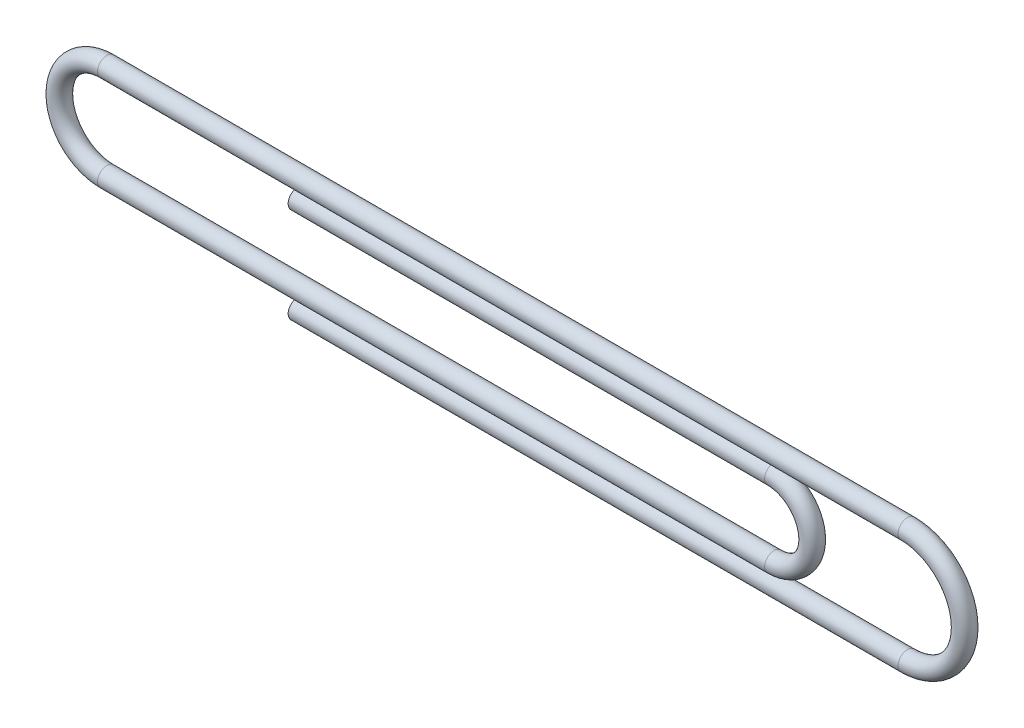
ISO-10303-21;
HEADER;
FILE_DESCRIPTION(('STEP AP214'),'2;1');
FILE_NAME('part.step','',(''),(''),'','','');
FILE_SCHEMA(('AUTOMOTIVE_DESIGN { 1 0 10303 214 1 1 1 1 }'));
ENDSEC;
DATA;
#1=APPLICATION_CONTEXT('core data for automotive mechanical design processes');
#2=APPLICATION_PROTOCOL_DEFINITION('international standard','automotive_design',2000,#1);
#3=PRODUCT_CONTEXT('',#1,'mechanical');
#4=PRODUCT('Part','Part','',(#3));
#5=PRODUCT_RELATED_PRODUCT_CATEGORY('part','',(#4));
#6=PRODUCT_DEFINITION_FORMATION('','',#4);
#7=PRODUCT_DEFINITION_CONTEXT('part definition',#1,'design');
#8=PRODUCT_DEFINITION('design','',#6,#7);
#9=PRODUCT_DEFINITION_SHAPE('','',#8);
#10=(LENGTH_UNIT() NAMED_UNIT(*) SI_UNIT(.MILLI.,.METRE.));
#11=(NAMED_UNIT(*) PLANE_ANGLE_UNIT() SI_UNIT($,.RADIAN.));
#12=(NAMED_UNIT(*) SI_UNIT($,.STERADIAN.) SOLID_ANGLE_UNIT());
#13=UNCERTAINTY_MEASURE_WITH_UNIT(LENGTH_MEASURE(1.E-05),#10,'distance_accuracy_value','');
#14=(GEOMETRIC_REPRESENTATION_CONTEXT(3) GLOBAL_UNCERTAINTY_ASSIGNED_CONTEXT((#13)) GLOBAL_UNIT_ASSIGNED_CONTEXT((#10,
#11,#12)) REPRESENTATION_CONTEXT('',''));
#15=CARTESIAN_POINT('',(0.,0.,0.));
#16=DIRECTION('',(0.,0.,1.));
#17=DIRECTION('',(1.,0.,0.));
#18=AXIS2_PLACEMENT_3D('',#15,#16,#17);
#19=CARTESIAN_POINT('',(-8.34532374100722,2.11151079136692,0.));
#20=DIRECTION('',(-1.,0.,0.));
#21=DIRECTION('',(0.,0.,-1.));
#22=AXIS2_PLACEMENT_3D('',#19,#20,#21);
#23=PLANE('',#22);
#24=CARTESIAN_POINT('',(-8.34532374100722,2.11151079136692,0.));
#25=DIRECTION('',(-1.,0.,0.));
#26=DIRECTION('',(0.,0.,-1.));
#27=AXIS2_PLACEMENT_3D('',#24,#25,#26);
#28=CIRCLE('',#27,0.495);
#29=CARTESIAN_POINT('',(-8.34532374100722,2.11151079136692,-0.495));
#30=VERTEX_POINT('',#29);
#31=EDGE_CURVE('E84',#30,#30,#28,.T.);
#32=ORIENTED_EDGE('',*,*,#31,.T.);
#33=EDGE_LOOP('',(#32));
#34=FACE_BOUND('',#33,.T.);
#35=ADVANCED_FACE('F49',(#34),#23,.T.);
#36=CARTESIAN_POINT('',(-8.34532374100722,-2.88848920863308,0.));
#37=DIRECTION('',(1.,0.,0.));
#38=DIRECTION('',(0.,0.,-1.));
#39=AXIS2_PLACEMENT_3D('',#36,#37,#38);
#40=PLANE('',#39);
#41=CARTESIAN_POINT('',(-8.34532374100722,-2.88848920863308,0.));
#42=DIRECTION('',(1.,0.,0.));
#43=DIRECTION('',(0.,0.,-1.));
#44=AXIS2_PLACEMENT_3D('',#41,#42,#43);
#45=CIRCLE('',#44,0.495);
#46=CARTESIAN_POINT('',(-8.34532374100722,-2.88848920863308,-0.495));
#47=VERTEX_POINT('',#46);
#48=EDGE_CURVE('E11',#47,#47,#45,.T.);
#49=ORIENTED_EDGE('',*,*,#48,.F.);
#50=EDGE_LOOP('',(#49));
#51=FACE_BOUND('',#50,.T.);
#52=ADVANCED_FACE('F93',(#51),#40,.F.);
#53=CARTESIAN_POINT('',(-8.34532374100722,2.11151079136692,0.));
#54=DIRECTION('',(1.,0.,0.));
#55=DIRECTION('',(0.,1.,0.));
#56=AXIS2_PLACEMENT_3D('',#53,#54,#55);
#57=CYLINDRICAL_SURFACE('',#56,0.495);
#58=CARTESIAN_POINT('',(16.6546762589928,2.11151079136692,0.));
#59=DIRECTION('',(-1.,0.,0.));
#60=DIRECTION('',(0.,0.,-1.));
#61=AXIS2_PLACEMENT_3D('',#58,#59,#60);
#62=CIRCLE('',#61,0.495);
#63=CARTESIAN_POINT('',(16.6546762589928,2.60651079136692,0.));
#64=VERTEX_POINT('',#63);
#65=EDGE_CURVE('E80',#64,#64,#62,.T.);
#66=ORIENTED_EDGE('',*,*,#65,.T.);
#67=EDGE_LOOP('',(#66));
#68=FACE_BOUND('',#67,.T.);
#69=ORIENTED_EDGE('',*,*,#31,.F.);
#70=EDGE_LOOP('',(#69));
#71=FACE_BOUND('',#70,.T.);
#72=ADVANCED_FACE('F90',(#68,#71),#57,.T.);
#73=CARTESIAN_POINT('',(16.6546762589928,0.111510791366919,0.));
#74=DIRECTION('',(0.,0.,-1.));
#75=DIRECTION('',(-1.,0.,0.));
#76=AXIS2_PLACEMENT_3D('',#73,#74,#75);
#77=TOROIDAL_SURFACE('',#76,2.,0.495);
#78=CARTESIAN_POINT('',(16.6546762589928,-1.88848920863308,0.));
#79=DIRECTION('',(1.,0.,0.));
#80=DIRECTION('',(0.,0.,-1.));
#81=AXIS2_PLACEMENT_3D('',#78,#79,#80);
#82=CIRCLE('',#81,0.495);
#83=CARTESIAN_POINT('',(16.6546762589928,-2.38348920863308,0.));
#84=VERTEX_POINT('',#83);
#85=EDGE_CURVE('E76',#84,#84,#82,.T.);
#86=CARTESIAN_POINT('',(16.6546762589928,0.111510791366919,0.));
#87=DIRECTION('',(0.,0.,-1.));
#88=DIRECTION('',(-1.,0.,0.));
#89=AXIS2_PLACEMENT_3D('',#86,#87,#88);
#90=CIRCLE('',#89,2.495);
#91=EDGE_CURVE('',#64,#84,#90,.T.);
#92=ORIENTED_EDGE('',*,*,#65,.F.);
#93=ORIENTED_EDGE('',*,*,#85,.T.);
#94=ORIENTED_EDGE('',*,*,#91,.T.);
#95=ORIENTED_EDGE('',*,*,#91,.F.);
#96=EDGE_LOOP('',(#92,#94,#93,#95));
#97=FACE_BOUND('',#96,.T.);
#98=ADVANCED_FACE('F92',(#97),#77,.T.);
#99=CARTESIAN_POINT('',(16.6546762589928,-1.88848920863308,0.));
#100=DIRECTION('',(-1.,0.,0.));
#101=DIRECTION('',(0.,-1.,0.));
#102=AXIS2_PLACEMENT_3D('',#99,#100,#101);
#103=CYLINDRICAL_SURFACE('',#102,0.495);
#104=CARTESIAN_POINT('',(-18.3453237410072,-1.88848920863308,0.));
#105=DIRECTION('',(1.,0.,0.));
#106=DIRECTION('',(0.,0.,-1.));
#107=AXIS2_PLACEMENT_3D('',#104,#105,#106);
#108=CIRCLE('',#107,0.495);
#109=CARTESIAN_POINT('',(-18.3453237410072,-2.38348920863309,0.));
#110=VERTEX_POINT('',#109);
#111=EDGE_CURVE('E72',#110,#110,#108,.T.);
#112=ORIENTED_EDGE('',*,*,#111,.T.);
#113=EDGE_LOOP('',(#112));
#114=FACE_BOUND('',#113,.T.);
#115=ORIENTED_EDGE('',*,*,#85,.F.);
#116=EDGE_LOOP('',(#115));
#117=FACE_BOUND('',#116,.T.);
#118=ADVANCED_FACE('F100',(#114,#117),#103,.T.);
#119=CARTESIAN_POINT('',(-18.3453237410072,0.611510791366914,0.));
#120=DIRECTION('',(0.,0.,-1.));
#121=DIRECTION('',(-1.,0.,0.));
#122=AXIS2_PLACEMENT_3D('',#119,#120,#121);
#123=TOROIDAL_SURFACE('',#122,2.5,0.495);
#124=CARTESIAN_POINT('',(-18.3453237410072,3.11151079136691,0.));
#125=DIRECTION('',(-1.,0.,0.));
#126=DIRECTION('',(0.,0.,-1.));
#127=AXIS2_PLACEMENT_3D('',#124,#125,#126);
#128=CIRCLE('',#127,0.495);
#129=CARTESIAN_POINT('',(-18.3453237410072,3.60651079136691,0.));
#130=VERTEX_POINT('',#129);
#131=EDGE_CURVE('E66',#130,#130,#128,.T.);
#132=CARTESIAN_POINT('',(-18.3453237410072,0.611510791366914,0.));
#133=DIRECTION('',(0.,0.,-1.));
#134=DIRECTION('',(-1.,0.,0.));
#135=AXIS2_PLACEMENT_3D('',#132,#133,#134);
#136=CIRCLE('',#135,2.995);
#137=EDGE_CURVE('',#110,#130,#136,.T.);
#138=ORIENTED_EDGE('',*,*,#111,.F.);
#139=ORIENTED_EDGE('',*,*,#131,.T.);
#140=ORIENTED_EDGE('',*,*,#137,.T.);
#141=ORIENTED_EDGE('',*,*,#137,.F.);
#142=EDGE_LOOP('',(#138,#140,#139,#141));
#143=FACE_BOUND('',#142,.T.);
#144=ADVANCED_FACE('F117',(#143),#123,.T.);
#145=CARTESIAN_POINT('',(-18.3453237410072,3.11151079136691,0.));
#146=DIRECTION('',(1.,0.,0.));
#147=DIRECTION('',(0.,0.,-1.));
#148=AXIS2_PLACEMENT_3D('',#145,#146,#147);
#149=CYLINDRICAL_SURFACE('',#148,0.495);
#150=CARTESIAN_POINT('',(23.6546762589928,3.11151079136691,0.));
#151=DIRECTION('',(-1.,0.,0.));
#152=DIRECTION('',(0.,0.,-1.));
#153=AXIS2_PLACEMENT_3D('',#150,#151,#152);
#154=CIRCLE('',#153,0.495);
#155=CARTESIAN_POINT('',(23.6546762589928,3.60651079136691,0.));
#156=VERTEX_POINT('',#155);
#157=EDGE_CURVE('E61',#156,#156,#154,.T.);
#158=ORIENTED_EDGE('',*,*,#157,.T.);
#159=EDGE_LOOP('',(#158));
#160=FACE_BOUND('',#159,.T.);
#161=ORIENTED_EDGE('',*,*,#131,.F.);
#162=EDGE_LOOP('',(#161));
#163=FACE_BOUND('',#162,.T.);
#164=ADVANCED_FACE('F111',(#160,#163),#149,.T.);
#165=CARTESIAN_POINT('',(23.6546762589928,0.111510791366916,0.));
#166=DIRECTION('',(0.,0.,-1.));
#167=DIRECTION('',(-1.,0.,0.));
#168=AXIS2_PLACEMENT_3D('',#165,#166,#167);
#169=TOROIDAL_SURFACE('',#168,3.,0.495);
#170=CARTESIAN_POINT('',(23.6546762589928,-2.88848920863308,0.));
#171=DIRECTION('',(1.,0.,0.));
#172=DIRECTION('',(0.,0.,-1.));
#173=AXIS2_PLACEMENT_3D('',#170,#171,#172);
#174=CIRCLE('',#173,0.495);
#175=CARTESIAN_POINT('',(23.6546762589928,-3.38348920863308,0.));
#176=VERTEX_POINT('',#175);
#177=EDGE_CURVE('E56',#176,#176,#174,.T.);
#178=CARTESIAN_POINT('',(23.6546762589928,0.111510791366916,0.));
#179=DIRECTION('',(0.,0.,-1.));
#180=DIRECTION('',(-1.,0.,0.));
#181=AXIS2_PLACEMENT_3D('',#178,#179,#180);
#182=CIRCLE('',#181,3.495);
#183=EDGE_CURVE('',#156,#176,#182,.T.);
#184=ORIENTED_EDGE('',*,*,#157,.F.);
#185=ORIENTED_EDGE('',*,*,#177,.T.);
#186=ORIENTED_EDGE('',*,*,#183,.T.);
#187=ORIENTED_EDGE('',*,*,#183,.F.);
#188=EDGE_LOOP('',(#184,#186,#185,#187));
#189=FACE_BOUND('',#188,.T.);
#190=ADVANCED_FACE('F106',(#189),#169,.T.);
#191=CARTESIAN_POINT('',(23.6546762589928,-2.88848920863308,0.));
#192=DIRECTION('',(-1.,0.,0.));
#193=DIRECTION('',(0.,-1.,0.));
#194=AXIS2_PLACEMENT_3D('',#191,#192,#193);
#195=CYLINDRICAL_SURFACE('',#194,0.495);
#196=ORIENTED_EDGE('',*,*,#48,.T.);
#197=EDGE_LOOP('',(#196));
#198=FACE_BOUND('',#197,.T.);
#199=ORIENTED_EDGE('',*,*,#177,.F.);
#200=EDGE_LOOP('',(#199));
#201=FACE_BOUND('',#200,.T.);
#202=ADVANCED_FACE('F104',(#198,#201),#195,.T.);
#203=CLOSED_SHELL('',(#35,#52,#72,#98,#118,#144,#164,#190,#202));
#204=MANIFOLD_SOLID_BREP('B2',#203);
#205=ADVANCED_BREP_SHAPE_REPRESENTATION('',(#18,#204),#14);
#206=SHAPE_DEFINITION_REPRESENTATION(#9,#205);
ENDSEC;
END-ISO-10303-21;
